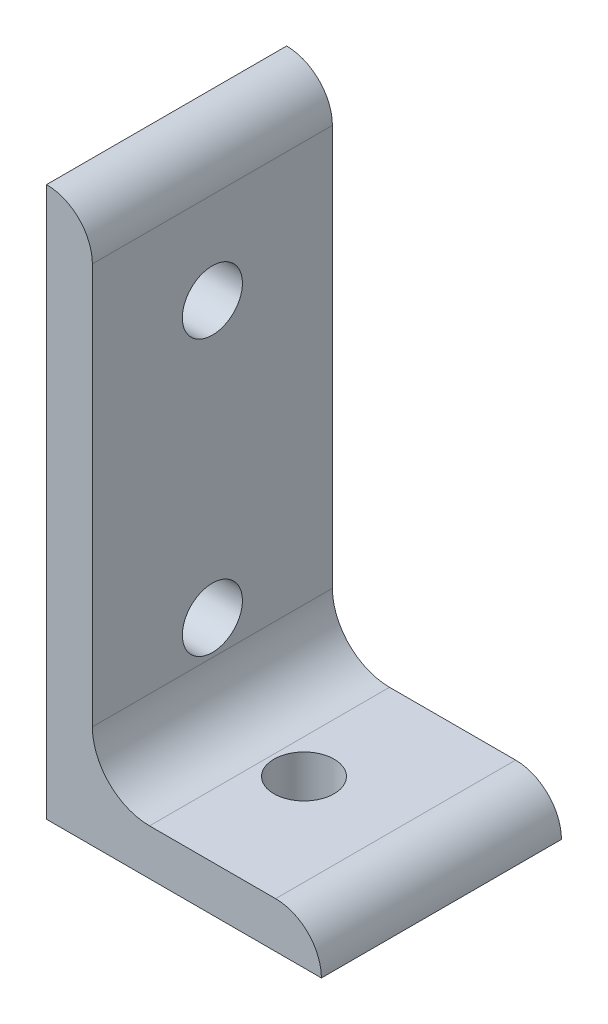
ISO-10303-21;
HEADER;
FILE_DESCRIPTION(('STEP AP214'),'2;1');
FILE_NAME('part.step','',(''),(''),'','','');
FILE_SCHEMA(('AUTOMOTIVE_DESIGN { 1 0 10303 214 1 1 1 1 }'));
ENDSEC;
DATA;
#1=APPLICATION_CONTEXT('core data for automotive mechanical design processes');
#2=APPLICATION_PROTOCOL_DEFINITION('international standard','automotive_design',2000,#1);
#3=PRODUCT_CONTEXT('',#1,'mechanical');
#4=PRODUCT('Part','Part','',(#3));
#5=PRODUCT_RELATED_PRODUCT_CATEGORY('part','',(#4));
#6=PRODUCT_DEFINITION_FORMATION('','',#4);
#7=PRODUCT_DEFINITION_CONTEXT('part definition',#1,'design');
#8=PRODUCT_DEFINITION('design','',#6,#7);
#9=PRODUCT_DEFINITION_SHAPE('','',#8);
#10=(LENGTH_UNIT() NAMED_UNIT(*) SI_UNIT(.MILLI.,.METRE.));
#11=(NAMED_UNIT(*) PLANE_ANGLE_UNIT() SI_UNIT($,.RADIAN.));
#12=(NAMED_UNIT(*) SI_UNIT($,.STERADIAN.) SOLID_ANGLE_UNIT());
#13=UNCERTAINTY_MEASURE_WITH_UNIT(LENGTH_MEASURE(1.E-05),#10,'distance_accuracy_value','');
#14=(GEOMETRIC_REPRESENTATION_CONTEXT(3) GLOBAL_UNCERTAINTY_ASSIGNED_CONTEXT((#13)) GLOBAL_UNIT_ASSIGNED_CONTEXT((#10,
#11,#12)) REPRESENTATION_CONTEXT('',''));
#15=CARTESIAN_POINT('',(0.,0.,0.));
#16=DIRECTION('',(0.,0.,1.));
#17=DIRECTION('',(1.,0.,0.));
#18=AXIS2_PLACEMENT_3D('',#15,#16,#17);
#19=CARTESIAN_POINT('',(38.1,0.,16.637));
#20=DIRECTION('',(0.,1.,0.));
#21=DIRECTION('',(-1.,0.,0.));
#22=AXIS2_PLACEMENT_3D('',#19,#20,#21);
#23=PLANE('',#22);
#24=CARTESIAN_POINT('',(19.05,0.,0.));
#25=DIRECTION('',(0.,-1.,0.));
#26=DIRECTION('',(1.,0.,0.));
#27=AXIS2_PLACEMENT_3D('',#24,#25,#26);
#28=CIRCLE('',#27,4.1656);
#29=CARTESIAN_POINT('',(23.2156,0.,0.));
#30=VERTEX_POINT('',#29);
#31=EDGE_CURVE('E167',#30,#30,#28,.T.);
#32=ORIENTED_EDGE('',*,*,#31,.F.);
#33=EDGE_LOOP('',(#32));
#34=FACE_BOUND('',#33,.T.);
#35=DIRECTION('',(1.,0.,0.));
#36=VECTOR('',#35,1.);
#37=CARTESIAN_POINT('',(38.1,0.,-16.637));
#38=LINE('',#37,#36);
#39=CARTESIAN_POINT('',(0.,0.,-16.637));
#40=VERTEX_POINT('',#39);
#41=CARTESIAN_POINT('',(38.1,0.,-16.637));
#42=VERTEX_POINT('',#41);
#43=EDGE_CURVE('E115',#40,#42,#38,.T.);
#44=ORIENTED_EDGE('',*,*,#43,.T.);
#45=DIRECTION('',(0.,0.,-1.));
#46=VECTOR('',#45,1.);
#47=CARTESIAN_POINT('',(38.1,0.,16.637));
#48=LINE('',#47,#46);
#49=CARTESIAN_POINT('',(38.1,0.,16.637));
#50=VERTEX_POINT('',#49);
#51=EDGE_CURVE('E113',#50,#42,#48,.T.);
#52=ORIENTED_EDGE('',*,*,#51,.F.);
#53=DIRECTION('',(1.,0.,0.));
#54=VECTOR('',#53,1.);
#55=CARTESIAN_POINT('',(38.1,0.,16.637));
#56=LINE('',#55,#54);
#57=CARTESIAN_POINT('',(0.,0.,16.637));
#58=VERTEX_POINT('',#57);
#59=EDGE_CURVE('E98',#58,#50,#56,.T.);
#60=ORIENTED_EDGE('',*,*,#59,.F.);
#61=DIRECTION('',(0.,0.,-1.));
#62=VECTOR('',#61,1.);
#63=CARTESIAN_POINT('',(0.,0.,16.637));
#64=LINE('',#63,#62);
#65=EDGE_CURVE('E139',#58,#40,#64,.T.);
#66=ORIENTED_EDGE('',*,*,#65,.T.);
#67=EDGE_LOOP('',(#44,#52,#60,#66));
#68=FACE_BOUND('',#67,.T.);
#69=ADVANCED_FACE('F39',(#34,#68),#23,.F.);
#70=CARTESIAN_POINT('',(14.2748,6.35,16.637));
#71=DIRECTION('',(0.,-1.,0.));
#72=DIRECTION('',(1.,0.,0.));
#73=AXIS2_PLACEMENT_3D('',#70,#71,#72);
#74=PLANE('',#73);
#75=CARTESIAN_POINT('',(19.05,6.34999999999999,0.));
#76=DIRECTION('',(0.,-1.,0.));
#77=DIRECTION('',(1.,0.,0.));
#78=AXIS2_PLACEMENT_3D('',#75,#76,#77);
#79=CIRCLE('',#78,4.1656);
#80=CARTESIAN_POINT('',(23.2156,6.34999999999999,0.));
#81=VERTEX_POINT('',#80);
#82=EDGE_CURVE('E43',#81,#81,#79,.T.);
#83=ORIENTED_EDGE('',*,*,#82,.T.);
#84=EDGE_LOOP('',(#83));
#85=FACE_BOUND('',#84,.T.);
#86=DIRECTION('',(-1.,0.,0.));
#87=VECTOR('',#86,1.);
#88=CARTESIAN_POINT('',(14.2748,6.35,16.637));
#89=LINE('',#88,#87);
#90=CARTESIAN_POINT('',(31.75,6.35,16.637));
#91=VERTEX_POINT('',#90);
#92=CARTESIAN_POINT('',(14.2748,6.35,16.637));
#93=VERTEX_POINT('',#92);
#94=EDGE_CURVE('E108',#91,#93,#89,.T.);
#95=ORIENTED_EDGE('',*,*,#94,.F.);
#96=DIRECTION('',(0.,0.,-1.));
#97=VECTOR('',#96,1.);
#98=CARTESIAN_POINT('',(31.75,6.35,16.637));
#99=LINE('',#98,#97);
#100=CARTESIAN_POINT('',(31.75,6.35,-16.637));
#101=VERTEX_POINT('',#100);
#102=EDGE_CURVE('E117',#91,#101,#99,.T.);
#103=ORIENTED_EDGE('',*,*,#102,.T.);
#104=DIRECTION('',(-1.,0.,0.));
#105=VECTOR('',#104,1.);
#106=CARTESIAN_POINT('',(14.2748,6.35,-16.637));
#107=LINE('',#106,#105);
#108=CARTESIAN_POINT('',(14.2748,6.35,-16.637));
#109=VERTEX_POINT('',#108);
#110=EDGE_CURVE('E146',#101,#109,#107,.T.);
#111=ORIENTED_EDGE('',*,*,#110,.T.);
#112=DIRECTION('',(0.,0.,-1.));
#113=VECTOR('',#112,1.);
#114=CARTESIAN_POINT('',(14.2748,6.35,16.637));
#115=LINE('',#114,#113);
#116=EDGE_CURVE('E118',#93,#109,#115,.T.);
#117=ORIENTED_EDGE('',*,*,#116,.F.);
#118=EDGE_LOOP('',(#95,#103,#111,#117));
#119=FACE_BOUND('',#118,.T.);
#120=ADVANCED_FACE('F174',(#85,#119),#74,.F.);
#121=CARTESIAN_POINT('',(14.2748,14.2748,16.637));
#122=DIRECTION('',(0.,0.,-1.));
#123=DIRECTION('',(-1.,0.,0.));
#124=AXIS2_PLACEMENT_3D('',#121,#122,#123);
#125=CYLINDRICAL_SURFACE('',#124,7.9248);
#126=CARTESIAN_POINT('',(14.2748,14.2748,-16.637));
#127=DIRECTION('',(0.,0.,-1.));
#128=DIRECTION('',(1.,0.,0.));
#129=AXIS2_PLACEMENT_3D('',#126,#127,#128);
#130=CIRCLE('',#129,7.9248);
#131=CARTESIAN_POINT('',(6.34999999999999,14.2748,-16.637));
#132=VERTEX_POINT('',#131);
#133=EDGE_CURVE('E144',#109,#132,#130,.T.);
#134=ORIENTED_EDGE('',*,*,#133,.T.);
#135=DIRECTION('',(0.,0.,-1.));
#136=VECTOR('',#135,1.);
#137=CARTESIAN_POINT('',(6.34999999999999,14.2748,16.637));
#138=LINE('',#137,#136);
#139=CARTESIAN_POINT('',(6.34999999999999,14.2748,16.637));
#140=VERTEX_POINT('',#139);
#141=EDGE_CURVE('E133',#140,#132,#138,.T.);
#142=ORIENTED_EDGE('',*,*,#141,.F.);
#143=CARTESIAN_POINT('',(14.2748,14.2748,16.637));
#144=DIRECTION('',(0.,0.,-1.));
#145=DIRECTION('',(1.,0.,0.));
#146=AXIS2_PLACEMENT_3D('',#143,#144,#145);
#147=CIRCLE('',#146,7.9248);
#148=EDGE_CURVE('E153',#93,#140,#147,.T.);
#149=ORIENTED_EDGE('',*,*,#148,.F.);
#150=ORIENTED_EDGE('',*,*,#116,.T.);
#151=EDGE_LOOP('',(#134,#142,#149,#150));
#152=FACE_BOUND('',#151,.T.);
#153=ADVANCED_FACE('F193',(#152),#125,.F.);
#154=CARTESIAN_POINT('',(6.34999999999999,76.2,16.637));
#155=DIRECTION('',(-1.,0.,0.));
#156=DIRECTION('',(0.,-1.,0.));
#157=AXIS2_PLACEMENT_3D('',#154,#155,#156);
#158=PLANE('',#157);
#159=CARTESIAN_POINT('',(6.34999999999999,19.05,0.));
#160=DIRECTION('',(-1.,0.,0.));
#161=DIRECTION('',(0.,-1.,0.));
#162=AXIS2_PLACEMENT_3D('',#159,#160,#161);
#163=CIRCLE('',#162,4.1656);
#164=CARTESIAN_POINT('',(6.35,14.8844,0.));
#165=VERTEX_POINT('',#164);
#166=EDGE_CURVE('E161',#165,#165,#163,.T.);
#167=ORIENTED_EDGE('',*,*,#166,.T.);
#168=EDGE_LOOP('',(#167));
#169=FACE_BOUND('',#168,.T.);
#170=CARTESIAN_POINT('',(6.34999999999999,57.15,0.));
#171=DIRECTION('',(-1.,0.,0.));
#172=DIRECTION('',(0.,-1.,0.));
#173=AXIS2_PLACEMENT_3D('',#170,#171,#172);
#174=CIRCLE('',#173,4.1656);
#175=CARTESIAN_POINT('',(6.34999999999999,52.9844,0.));
#176=VERTEX_POINT('',#175);
#177=EDGE_CURVE('E149',#176,#176,#174,.T.);
#178=ORIENTED_EDGE('',*,*,#177,.T.);
#179=EDGE_LOOP('',(#178));
#180=FACE_BOUND('',#179,.T.);
#181=DIRECTION('',(0.,1.,0.));
#182=VECTOR('',#181,1.);
#183=CARTESIAN_POINT('',(6.34999999999999,76.2,-16.637));
#184=LINE('',#183,#182);
#185=CARTESIAN_POINT('',(6.34999999999999,69.85,-16.637));
#186=VERTEX_POINT('',#185);
#187=EDGE_CURVE('E142',#132,#186,#184,.T.);
#188=ORIENTED_EDGE('',*,*,#187,.T.);
#189=DIRECTION('',(0.,0.,-1.));
#190=VECTOR('',#189,1.);
#191=CARTESIAN_POINT('',(6.34999999999999,69.85,16.637));
#192=LINE('',#191,#190);
#193=CARTESIAN_POINT('',(6.34999999999999,69.85,16.637));
#194=VERTEX_POINT('',#193);
#195=EDGE_CURVE('E11',#186,#194,#192,.F.);
#196=ORIENTED_EDGE('',*,*,#195,.T.);
#197=DIRECTION('',(0.,1.,0.));
#198=VECTOR('',#197,1.);
#199=CARTESIAN_POINT('',(6.34999999999999,76.2,16.637));
#200=LINE('',#199,#198);
#201=EDGE_CURVE('E151',#140,#194,#200,.T.);
#202=ORIENTED_EDGE('',*,*,#201,.F.);
#203=ORIENTED_EDGE('',*,*,#141,.T.);
#204=EDGE_LOOP('',(#188,#196,#202,#203));
#205=FACE_BOUND('',#204,.T.);
#206=ADVANCED_FACE('F214',(#169,#180,#205),#158,.F.);
#207=CARTESIAN_POINT('',(0.,0.,16.637));
#208=DIRECTION('',(1.,0.,0.));
#209=DIRECTION('',(0.,1.,0.));
#210=AXIS2_PLACEMENT_3D('',#207,#208,#209);
#211=PLANE('',#210);
#212=CARTESIAN_POINT('',(0.,19.05,0.));
#213=DIRECTION('',(-1.,0.,0.));
#214=DIRECTION('',(0.,-1.,0.));
#215=AXIS2_PLACEMENT_3D('',#212,#213,#214);
#216=CIRCLE('',#215,4.1656);
#217=CARTESIAN_POINT('',(0.,14.8844,0.));
#218=VERTEX_POINT('',#217);
#219=EDGE_CURVE('E164',#218,#218,#216,.T.);
#220=ORIENTED_EDGE('',*,*,#219,.F.);
#221=EDGE_LOOP('',(#220));
#222=FACE_BOUND('',#221,.T.);
#223=CARTESIAN_POINT('',(0.,57.15,0.));
#224=DIRECTION('',(-1.,0.,0.));
#225=DIRECTION('',(0.,-1.,0.));
#226=AXIS2_PLACEMENT_3D('',#223,#224,#225);
#227=CIRCLE('',#226,4.1656);
#228=CARTESIAN_POINT('',(0.,52.9844,0.));
#229=VERTEX_POINT('',#228);
#230=EDGE_CURVE('E158',#229,#229,#227,.T.);
#231=ORIENTED_EDGE('',*,*,#230,.F.);
#232=EDGE_LOOP('',(#231));
#233=FACE_BOUND('',#232,.T.);
#234=DIRECTION('',(0.,-1.,0.));
#235=VECTOR('',#234,1.);
#236=CARTESIAN_POINT('',(0.,0.,-16.637));
#237=LINE('',#236,#235);
#238=CARTESIAN_POINT('',(0.,76.2,-16.637));
#239=VERTEX_POINT('',#238);
#240=EDGE_CURVE('E109',#239,#40,#237,.T.);
#241=ORIENTED_EDGE('',*,*,#240,.T.);
#242=ORIENTED_EDGE('',*,*,#65,.F.);
#243=DIRECTION('',(0.,-1.,0.));
#244=VECTOR('',#243,1.);
#245=CARTESIAN_POINT('',(0.,0.,16.637));
#246=LINE('',#245,#244);
#247=CARTESIAN_POINT('',(0.,76.2,16.637));
#248=VERTEX_POINT('',#247);
#249=EDGE_CURVE('E104',#248,#58,#246,.T.);
#250=ORIENTED_EDGE('',*,*,#249,.F.);
#251=DIRECTION('',(0.,0.,-1.));
#252=VECTOR('',#251,1.);
#253=CARTESIAN_POINT('',(0.,76.2,16.637));
#254=LINE('',#253,#252);
#255=EDGE_CURVE('E136',#248,#239,#254,.T.);
#256=ORIENTED_EDGE('',*,*,#255,.T.);
#257=EDGE_LOOP('',(#241,#242,#250,#256));
#258=FACE_BOUND('',#257,.T.);
#259=ADVANCED_FACE('F207',(#222,#233,#258),#211,.F.);
#260=CARTESIAN_POINT('',(14.2748,14.2748,16.637));
#261=DIRECTION('',(0.,0.,1.));
#262=DIRECTION('',(1.,0.,0.));
#263=AXIS2_PLACEMENT_3D('',#260,#261,#262);
#264=PLANE('',#263);
#265=ORIENTED_EDGE('',*,*,#59,.T.);
#266=CARTESIAN_POINT('',(31.75,0.,16.637));
#267=DIRECTION('',(0.,0.,1.));
#268=DIRECTION('',(1.,0.,0.));
#269=AXIS2_PLACEMENT_3D('',#266,#267,#268);
#270=CIRCLE('',#269,6.35);
#271=EDGE_CURVE('E48',#50,#91,#270,.T.);
#272=ORIENTED_EDGE('',*,*,#271,.T.);
#273=ORIENTED_EDGE('',*,*,#94,.T.);
#274=ORIENTED_EDGE('',*,*,#148,.T.);
#275=ORIENTED_EDGE('',*,*,#201,.T.);
#276=CARTESIAN_POINT('',(0.,69.85,16.637));
#277=DIRECTION('',(0.,0.,1.));
#278=DIRECTION('',(1.,0.,0.));
#279=AXIS2_PLACEMENT_3D('',#276,#277,#278);
#280=CIRCLE('',#279,6.35);
#281=EDGE_CURVE('E123',#194,#248,#280,.T.);
#282=ORIENTED_EDGE('',*,*,#281,.T.);
#283=ORIENTED_EDGE('',*,*,#249,.T.);
#284=EDGE_LOOP('',(#265,#272,#273,#274,#275,#282,#283));
#285=FACE_BOUND('',#284,.T.);
#286=ADVANCED_FACE('F100',(#285),#264,.T.);
#287=CARTESIAN_POINT('',(14.2748,14.2748,-16.637));
#288=DIRECTION('',(0.,0.,1.));
#289=DIRECTION('',(1.,0.,0.));
#290=AXIS2_PLACEMENT_3D('',#287,#288,#289);
#291=PLANE('',#290);
#292=ORIENTED_EDGE('',*,*,#110,.F.);
#293=CARTESIAN_POINT('',(31.75,0.,-16.637));
#294=DIRECTION('',(0.,0.,1.));
#295=DIRECTION('',(1.,0.,0.));
#296=AXIS2_PLACEMENT_3D('',#293,#294,#295);
#297=CIRCLE('',#296,6.35);
#298=EDGE_CURVE('E125',#101,#42,#297,.F.);
#299=ORIENTED_EDGE('',*,*,#298,.T.);
#300=ORIENTED_EDGE('',*,*,#43,.F.);
#301=ORIENTED_EDGE('',*,*,#240,.F.);
#302=CARTESIAN_POINT('',(0.,69.85,-16.637));
#303=DIRECTION('',(0.,0.,1.));
#304=DIRECTION('',(1.,0.,0.));
#305=AXIS2_PLACEMENT_3D('',#302,#303,#304);
#306=CIRCLE('',#305,6.35);
#307=EDGE_CURVE('E61',#239,#186,#306,.F.);
#308=ORIENTED_EDGE('',*,*,#307,.T.);
#309=ORIENTED_EDGE('',*,*,#187,.F.);
#310=ORIENTED_EDGE('',*,*,#133,.F.);
#311=EDGE_LOOP('',(#292,#299,#300,#301,#308,#309,#310));
#312=FACE_BOUND('',#311,.T.);
#313=ADVANCED_FACE('F197',(#312),#291,.F.);
#314=CARTESIAN_POINT('',(31.75,0.,16.637));
#315=DIRECTION('',(0.,0.,-1.));
#316=DIRECTION('',(-1.,0.,0.));
#317=AXIS2_PLACEMENT_3D('',#314,#315,#316);
#318=CYLINDRICAL_SURFACE('',#317,6.35);
#319=ORIENTED_EDGE('',*,*,#271,.F.);
#320=ORIENTED_EDGE('',*,*,#51,.T.);
#321=ORIENTED_EDGE('',*,*,#298,.F.);
#322=ORIENTED_EDGE('',*,*,#102,.F.);
#323=EDGE_LOOP('',(#319,#320,#321,#322));
#324=FACE_BOUND('',#323,.T.);
#325=ADVANCED_FACE('F121',(#324),#318,.T.);
#326=CARTESIAN_POINT('',(0.,69.85,16.637));
#327=DIRECTION('',(0.,0.,-1.));
#328=DIRECTION('',(-1.,0.,0.));
#329=AXIS2_PLACEMENT_3D('',#326,#327,#328);
#330=CYLINDRICAL_SURFACE('',#329,6.35);
#331=ORIENTED_EDGE('',*,*,#281,.F.);
#332=ORIENTED_EDGE('',*,*,#195,.F.);
#333=ORIENTED_EDGE('',*,*,#307,.F.);
#334=ORIENTED_EDGE('',*,*,#255,.F.);
#335=EDGE_LOOP('',(#331,#332,#333,#334));
#336=FACE_BOUND('',#335,.T.);
#337=ADVANCED_FACE('F41',(#336),#330,.T.);
#338=CARTESIAN_POINT('',(38.1,57.15,0.));
#339=DIRECTION('',(-1.,0.,0.));
#340=DIRECTION('',(0.,-1.,0.));
#341=AXIS2_PLACEMENT_3D('',#338,#339,#340);
#342=CYLINDRICAL_SURFACE('',#341,4.1656);
#343=ORIENTED_EDGE('',*,*,#230,.T.);
#344=EDGE_LOOP('',(#343));
#345=FACE_BOUND('',#344,.T.);
#346=ORIENTED_EDGE('',*,*,#177,.F.);
#347=EDGE_LOOP('',(#346));
#348=FACE_BOUND('',#347,.T.);
#349=ADVANCED_FACE('F185',(#345,#348),#342,.F.);
#350=CARTESIAN_POINT('',(38.1,19.05,0.));
#351=DIRECTION('',(-1.,0.,0.));
#352=DIRECTION('',(0.,-1.,0.));
#353=AXIS2_PLACEMENT_3D('',#350,#351,#352);
#354=CYLINDRICAL_SURFACE('',#353,4.1656);
#355=ORIENTED_EDGE('',*,*,#219,.T.);
#356=EDGE_LOOP('',(#355));
#357=FACE_BOUND('',#356,.T.);
#358=ORIENTED_EDGE('',*,*,#166,.F.);
#359=EDGE_LOOP('',(#358));
#360=FACE_BOUND('',#359,.T.);
#361=ADVANCED_FACE('F179',(#357,#360),#354,.F.);
#362=CARTESIAN_POINT('',(19.05,76.2,0.));
#363=DIRECTION('',(0.,-1.,0.));
#364=DIRECTION('',(1.,0.,0.));
#365=AXIS2_PLACEMENT_3D('',#362,#363,#364);
#366=CYLINDRICAL_SURFACE('',#365,4.1656);
#367=CARTESIAN_POINT('',(23.2156,0.,0.));
#368=CARTESIAN_POINT('',(23.2156,0.0661458333333318,0.));
#369=CARTESIAN_POINT('',(23.2156,0.132291666666664,0.));
#370=CARTESIAN_POINT('',(23.2156,0.264583333333332,0.));
#371=CARTESIAN_POINT('',(23.2156,0.330729166666668,0.));
#372=CARTESIAN_POINT('',(23.2156,0.463020833333337,0.));
#373=CARTESIAN_POINT('',(23.2156,0.529166666666669,0.));
#374=CARTESIAN_POINT('',(23.2156,0.661458333333332,0.));
#375=CARTESIAN_POINT('',(23.2156,0.727604166666664,0.));
#376=CARTESIAN_POINT('',(23.2156,0.859895833333332,0.));
#377=CARTESIAN_POINT('',(23.2156,0.926041666666669,0.));
#378=CARTESIAN_POINT('',(23.2156,1.05833333333334,0.));
#379=CARTESIAN_POINT('',(23.2156,1.12447916666667,0.));
#380=CARTESIAN_POINT('',(23.2156,1.25677083333333,0.));
#381=CARTESIAN_POINT('',(23.2156,1.32291666666666,0.));
#382=CARTESIAN_POINT('',(23.2156,1.45520833333333,0.));
#383=CARTESIAN_POINT('',(23.2156,1.52135416666666,0.));
#384=CARTESIAN_POINT('',(23.2156,1.65364583333333,0.));
#385=CARTESIAN_POINT('',(23.2156,1.71979166666666,0.));
#386=CARTESIAN_POINT('',(23.2156,1.85208333333333,0.));
#387=CARTESIAN_POINT('',(23.2156,1.91822916666666,0.));
#388=CARTESIAN_POINT('',(23.2156,2.05052083333333,0.));
#389=CARTESIAN_POINT('',(23.2156,2.11666666666666,0.));
#390=CARTESIAN_POINT('',(23.2156,2.24895833333333,0.));
#391=CARTESIAN_POINT('',(23.2156,2.31510416666667,0.));
#392=CARTESIAN_POINT('',(23.2156,2.44739583333333,0.));
#393=CARTESIAN_POINT('',(23.2156,2.51354166666667,0.));
#394=CARTESIAN_POINT('',(23.2156,2.64583333333333,0.));
#395=CARTESIAN_POINT('',(23.2156,2.71197916666666,0.));
#396=CARTESIAN_POINT('',(23.2156,2.84427083333333,0.));
#397=CARTESIAN_POINT('',(23.2156,2.91041666666667,0.));
#398=CARTESIAN_POINT('',(23.2156,3.04270833333333,0.));
#399=CARTESIAN_POINT('',(23.2156,3.10885416666667,0.));
#400=CARTESIAN_POINT('',(23.2156,3.24114583333333,0.));
#401=CARTESIAN_POINT('',(23.2156,3.30729166666666,0.));
#402=CARTESIAN_POINT('',(23.2156,3.43958333333333,0.));
#403=CARTESIAN_POINT('',(23.2156,3.50572916666667,0.));
#404=CARTESIAN_POINT('',(23.2156,3.63802083333333,0.));
#405=CARTESIAN_POINT('',(23.2156,3.70416666666667,0.));
#406=CARTESIAN_POINT('',(23.2156,3.83645833333333,0.));
#407=CARTESIAN_POINT('',(23.2156,3.90260416666666,0.));
#408=CARTESIAN_POINT('',(23.2156,4.03489583333333,0.));
#409=CARTESIAN_POINT('',(23.2156,4.10104166666667,0.));
#410=CARTESIAN_POINT('',(23.2156,4.23333333333333,0.));
#411=CARTESIAN_POINT('',(23.2156,4.29947916666667,0.));
#412=CARTESIAN_POINT('',(23.2156,4.43177083333333,0.));
#413=CARTESIAN_POINT('',(23.2156,4.49791666666666,0.));
#414=CARTESIAN_POINT('',(23.2156,4.63020833333333,0.));
#415=CARTESIAN_POINT('',(23.2156,4.69635416666667,0.));
#416=CARTESIAN_POINT('',(23.2156,4.82864583333333,0.));
#417=CARTESIAN_POINT('',(23.2156,4.89479166666667,0.));
#418=CARTESIAN_POINT('',(23.2156,5.02708333333333,0.));
#419=CARTESIAN_POINT('',(23.2156,5.09322916666666,0.));
#420=CARTESIAN_POINT('',(23.2156,5.22552083333333,0.));
#421=CARTESIAN_POINT('',(23.2156,5.29166666666666,0.));
#422=CARTESIAN_POINT('',(23.2156,5.42395833333333,0.));
#423=CARTESIAN_POINT('',(23.2156,5.49010416666666,0.));
#424=CARTESIAN_POINT('',(23.2156,5.62239583333333,0.));
#425=CARTESIAN_POINT('',(23.2156,5.68854166666666,0.));
#426=CARTESIAN_POINT('',(23.2156,5.82083333333333,0.));
#427=CARTESIAN_POINT('',(23.2156,5.88697916666666,0.));
#428=CARTESIAN_POINT('',(23.2156,6.01927083333333,0.));
#429=CARTESIAN_POINT('',(23.2156,6.08541666666666,0.));
#430=CARTESIAN_POINT('',(23.2156,6.21770833333333,0.));
#431=CARTESIAN_POINT('',(23.2156,6.28385416666666,0.));
#432=CARTESIAN_POINT('',(23.2156,6.34999999999999,0.));
#433=B_SPLINE_CURVE_WITH_KNOTS('',3,(#367,#368,#369,#370,#371,#372,#373,#374,#375,#376,#377,
#378,#379,#380,#381,#382,#383,#384,#385,#386,#387,#388,#389,#390,#391,#392,#393,#394,#395,#396,
#397,#398,#399,#400,#401,#402,#403,#404,#405,#406,#407,#408,#409,#410,#411,#412,#413,#414,#415,
#416,#417,#418,#419,#420,#421,#422,#423,#424,#425,#426,#427,#428,#429,#430,#431,#432),
.UNSPECIFIED.,.F.,.F.,(4,2,2,2,2,2,2,2,2,2,2,2,2,2,2,2,2,2,2,2,2,2,2,2,2,2,2,2,2,2,2,2,4),(0.,
0.198437499999995,0.396875000000005,0.5953125,0.793749999999996,0.992187500000005,1.190625,
1.3890625,1.58749999999999,1.7859375,1.984375,2.18281249999999,2.38125,2.5796875,
2.77812499999999,2.9765625,3.175,3.37343749999999,3.571875,3.7703125,3.96874999999999,4.1671875,
4.365625,4.56406249999999,4.7625,4.9609375,5.15937499999999,5.35781249999999,5.55625,
5.75468749999999,5.95312499999999,6.1515625,6.34999999999999),.UNSPECIFIED.);
#434=EDGE_CURVE('BSEAM177',#30,#81,#433,.T.);
#435=ORIENTED_EDGE('',*,*,#31,.T.);
#436=ORIENTED_EDGE('',*,*,#82,.F.);
#437=ORIENTED_EDGE('',*,*,#434,.T.);
#438=ORIENTED_EDGE('',*,*,#434,.F.);
#439=EDGE_LOOP('',(#435,#437,#436,#438));
#440=FACE_BOUND('',#439,.T.);
#441=ADVANCED_FACE('F177',(#440),#366,.F.);
#442=CLOSED_SHELL('',(#69,#120,#153,#206,#259,#286,#313,#325,#337,#349,#361,#441));
#443=MANIFOLD_SOLID_BREP('B2',#442);
#444=ADVANCED_BREP_SHAPE_REPRESENTATION('',(#18,#443),#14);
#445=SHAPE_DEFINITION_REPRESENTATION(#9,#444);
ENDSEC;
END-ISO-10303-21;
